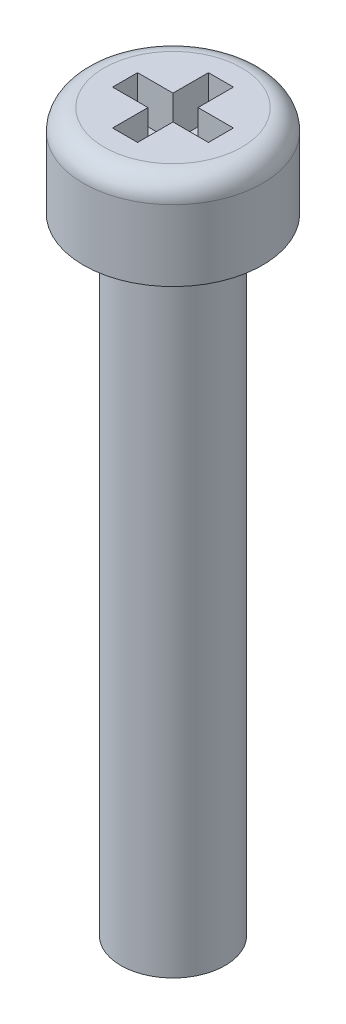
ISO-10303-21;
HEADER;
FILE_DESCRIPTION(('STEP AP214'),'2;1');
FILE_NAME('part.step','',(''),(''),'','','');
FILE_SCHEMA(('AUTOMOTIVE_DESIGN { 1 0 10303 214 1 1 1 1 }'));
ENDSEC;
DATA;
#1=APPLICATION_CONTEXT('core data for automotive mechanical design processes');
#2=APPLICATION_PROTOCOL_DEFINITION('international standard','automotive_design',2000,#1);
#3=PRODUCT_CONTEXT('',#1,'mechanical');
#4=PRODUCT('Part','Part','',(#3));
#5=PRODUCT_RELATED_PRODUCT_CATEGORY('part','',(#4));
#6=PRODUCT_DEFINITION_FORMATION('','',#4);
#7=PRODUCT_DEFINITION_CONTEXT('part definition',#1,'design');
#8=PRODUCT_DEFINITION('design','',#6,#7);
#9=PRODUCT_DEFINITION_SHAPE('','',#8);
#10=(LENGTH_UNIT() NAMED_UNIT(*) SI_UNIT(.MILLI.,.METRE.));
#11=(NAMED_UNIT(*) PLANE_ANGLE_UNIT() SI_UNIT($,.RADIAN.));
#12=(NAMED_UNIT(*) SI_UNIT($,.STERADIAN.) SOLID_ANGLE_UNIT());
#13=UNCERTAINTY_MEASURE_WITH_UNIT(LENGTH_MEASURE(1.E-05),#10,'distance_accuracy_value','');
#14=(GEOMETRIC_REPRESENTATION_CONTEXT(3) GLOBAL_UNCERTAINTY_ASSIGNED_CONTEXT((#13)) GLOBAL_UNIT_ASSIGNED_CONTEXT((#10,
#11,#12)) REPRESENTATION_CONTEXT('',''));
#15=CARTESIAN_POINT('',(0.,0.,0.));
#16=DIRECTION('',(0.,0.,1.));
#17=DIRECTION('',(1.,0.,0.));
#18=AXIS2_PLACEMENT_3D('',#15,#16,#17);
#19=CARTESIAN_POINT('',(0.,-15.,0.));
#20=DIRECTION('',(0.,1.,0.));
#21=DIRECTION('',(0.,0.,1.));
#22=AXIS2_PLACEMENT_3D('',#19,#20,#21);
#23=CYLINDRICAL_SURFACE('',#22,1.25);
#24=CARTESIAN_POINT('',(0.,-15.,0.));
#25=DIRECTION('',(0.,1.,0.));
#26=DIRECTION('',(0.,0.,1.));
#27=AXIS2_PLACEMENT_3D('',#24,#25,#26);
#28=CIRCLE('',#27,1.25);
#29=CARTESIAN_POINT('',(0.,-15.,1.25));
#30=VERTEX_POINT('',#29);
#31=EDGE_CURVE('E11',#30,#30,#28,.T.);
#32=ORIENTED_EDGE('',*,*,#31,.T.);
#33=EDGE_LOOP('',(#32));
#34=FACE_BOUND('',#33,.T.);
#35=CARTESIAN_POINT('',(0.,0.,0.));
#36=DIRECTION('',(0.,1.,0.));
#37=DIRECTION('',(0.,0.,1.));
#38=AXIS2_PLACEMENT_3D('',#35,#36,#37);
#39=CIRCLE('',#38,1.25);
#40=CARTESIAN_POINT('',(0.,0.,1.25));
#41=VERTEX_POINT('',#40);
#42=EDGE_CURVE('E48',#41,#41,#39,.T.);
#43=ORIENTED_EDGE('',*,*,#42,.F.);
#44=EDGE_LOOP('',(#43));
#45=FACE_BOUND('',#44,.T.);
#46=ADVANCED_FACE('F45',(#34,#45),#23,.T.);
#47=CARTESIAN_POINT('',(0.,-15.,0.));
#48=DIRECTION('',(0.,1.,0.));
#49=DIRECTION('',(0.,0.,1.));
#50=AXIS2_PLACEMENT_3D('',#47,#48,#49);
#51=PLANE('',#50);
#52=ORIENTED_EDGE('',*,*,#31,.F.);
#53=EDGE_LOOP('',(#52));
#54=FACE_BOUND('',#53,.T.);
#55=ADVANCED_FACE('F233',(#54),#51,.F.);
#56=CARTESIAN_POINT('',(0.,0.,0.));
#57=DIRECTION('',(0.,-1.,0.));
#58=DIRECTION('',(0.,0.,-1.));
#59=AXIS2_PLACEMENT_3D('',#56,#57,#58);
#60=PLANE('',#59);
#61=ORIENTED_EDGE('',*,*,#42,.T.);
#62=EDGE_LOOP('',(#61));
#63=FACE_BOUND('',#62,.T.);
#64=CARTESIAN_POINT('',(0.,0.,0.));
#65=DIRECTION('',(0.,-1.,0.));
#66=DIRECTION('',(0.,0.,-1.));
#67=AXIS2_PLACEMENT_3D('',#64,#65,#66);
#68=CIRCLE('',#67,2.15);
#69=CARTESIAN_POINT('',(0.,0.,-2.15));
#70=VERTEX_POINT('',#69);
#71=EDGE_CURVE('E223',#70,#70,#68,.T.);
#72=ORIENTED_EDGE('',*,*,#71,.T.);
#73=EDGE_LOOP('',(#72));
#74=FACE_BOUND('',#73,.T.);
#75=ADVANCED_FACE('F230',(#63,#74),#60,.T.);
#76=CARTESIAN_POINT('',(0.,0.,0.));
#77=DIRECTION('',(0.,-1.,0.));
#78=DIRECTION('',(0.,0.,-1.));
#79=AXIS2_PLACEMENT_3D('',#76,#77,#78);
#80=CYLINDRICAL_SURFACE('',#79,2.15);
#81=CARTESIAN_POINT('',(0.,1.7,0.));
#82=DIRECTION('',(0.,-1.,0.));
#83=DIRECTION('',(0.,0.,-1.));
#84=AXIS2_PLACEMENT_3D('',#81,#82,#83);
#85=CIRCLE('',#84,2.15);
#86=CARTESIAN_POINT('',(0.,1.7,-2.15));
#87=VERTEX_POINT('',#86);
#88=EDGE_CURVE('E220',#87,#87,#85,.T.);
#89=ORIENTED_EDGE('',*,*,#88,.T.);
#90=EDGE_LOOP('',(#89));
#91=FACE_BOUND('',#90,.T.);
#92=ORIENTED_EDGE('',*,*,#71,.F.);
#93=EDGE_LOOP('',(#92));
#94=FACE_BOUND('',#93,.T.);
#95=ADVANCED_FACE('F243',(#91,#94),#80,.T.);
#96=CARTESIAN_POINT('',(0.,1.7,0.));
#97=DIRECTION('',(0.,-1.,0.));
#98=DIRECTION('',(0.,0.,-1.));
#99=AXIS2_PLACEMENT_3D('',#96,#97,#98);
#100=TOROIDAL_SURFACE('',#99,1.65,0.5);
#101=CARTESIAN_POINT('',(0.,2.2,0.));
#102=DIRECTION('',(0.,-1.,0.));
#103=DIRECTION('',(0.,0.,-1.));
#104=AXIS2_PLACEMENT_3D('',#101,#102,#103);
#105=CIRCLE('',#104,1.65);
#106=CARTESIAN_POINT('',(0.,2.2,-1.65));
#107=VERTEX_POINT('',#106);
#108=EDGE_CURVE('E200',#107,#107,#105,.T.);
#109=ORIENTED_EDGE('',*,*,#108,.T.);
#110=EDGE_LOOP('',(#109));
#111=FACE_BOUND('',#110,.T.);
#112=ORIENTED_EDGE('',*,*,#88,.F.);
#113=EDGE_LOOP('',(#112));
#114=FACE_BOUND('',#113,.T.);
#115=ADVANCED_FACE('F248',(#111,#114),#100,.T.);
#116=CARTESIAN_POINT('',(0.,2.2,0.));
#117=DIRECTION('',(0.,1.,0.));
#118=DIRECTION('',(0.,0.,1.));
#119=AXIS2_PLACEMENT_3D('',#116,#117,#118);
#120=PLANE('',#119);
#121=DIRECTION('',(0.,0.,-1.));
#122=VECTOR('',#121,1.);
#123=CARTESIAN_POINT('',(0.3,2.2,-0.299999999999999));
#124=LINE('',#123,#122);
#125=CARTESIAN_POINT('',(0.3,2.2,-0.299999999999999));
#126=VERTEX_POINT('',#125);
#127=CARTESIAN_POINT('',(0.3,2.2,-1.15));
#128=VERTEX_POINT('',#127);
#129=EDGE_CURVE('E59',#126,#128,#124,.T.);
#130=ORIENTED_EDGE('',*,*,#129,.F.);
#131=DIRECTION('',(-1.,0.,0.));
#132=VECTOR('',#131,1.);
#133=CARTESIAN_POINT('',(0.3,2.2,-0.299999999999999));
#134=LINE('',#133,#132);
#135=CARTESIAN_POINT('',(1.15,2.2,-0.299999999999999));
#136=VERTEX_POINT('',#135);
#137=EDGE_CURVE('E196',#136,#126,#134,.T.);
#138=ORIENTED_EDGE('',*,*,#137,.F.);
#139=DIRECTION('',(0.,0.,-1.));
#140=VECTOR('',#139,1.);
#141=CARTESIAN_POINT('',(1.15,2.2,0.3));
#142=LINE('',#141,#140);
#143=CARTESIAN_POINT('',(1.15,2.2,0.3));
#144=VERTEX_POINT('',#143);
#145=EDGE_CURVE('E194',#144,#136,#142,.T.);
#146=ORIENTED_EDGE('',*,*,#145,.F.);
#147=DIRECTION('',(1.,0.,0.));
#148=VECTOR('',#147,1.);
#149=CARTESIAN_POINT('',(0.3,2.2,0.3));
#150=LINE('',#149,#148);
#151=CARTESIAN_POINT('',(0.3,2.2,0.3));
#152=VERTEX_POINT('',#151);
#153=EDGE_CURVE('E143',#152,#144,#150,.T.);
#154=ORIENTED_EDGE('',*,*,#153,.F.);
#155=DIRECTION('',(0.,0.,-1.));
#156=VECTOR('',#155,1.);
#157=CARTESIAN_POINT('',(0.3,2.2,1.15));
#158=LINE('',#157,#156);
#159=CARTESIAN_POINT('',(0.3,2.2,1.15));
#160=VERTEX_POINT('',#159);
#161=EDGE_CURVE('E190',#160,#152,#158,.T.);
#162=ORIENTED_EDGE('',*,*,#161,.F.);
#163=DIRECTION('',(1.,0.,0.));
#164=VECTOR('',#163,1.);
#165=CARTESIAN_POINT('',(-0.3,2.2,1.15));
#166=LINE('',#165,#164);
#167=CARTESIAN_POINT('',(-0.3,2.2,1.15));
#168=VERTEX_POINT('',#167);
#169=EDGE_CURVE('E187',#168,#160,#166,.T.);
#170=ORIENTED_EDGE('',*,*,#169,.F.);
#171=DIRECTION('',(0.,0.,1.));
#172=VECTOR('',#171,1.);
#173=CARTESIAN_POINT('',(-0.3,2.2,1.15));
#174=LINE('',#173,#172);
#175=CARTESIAN_POINT('',(-0.3,2.2,0.3));
#176=VERTEX_POINT('',#175);
#177=EDGE_CURVE('E184',#176,#168,#174,.T.);
#178=ORIENTED_EDGE('',*,*,#177,.F.);
#179=DIRECTION('',(1.,0.,0.));
#180=VECTOR('',#179,1.);
#181=CARTESIAN_POINT('',(-1.15,2.2,0.3));
#182=LINE('',#181,#180);
#183=CARTESIAN_POINT('',(-1.15,2.2,0.3));
#184=VERTEX_POINT('',#183);
#185=EDGE_CURVE('E181',#184,#176,#182,.T.);
#186=ORIENTED_EDGE('',*,*,#185,.F.);
#187=DIRECTION('',(0.,0.,1.));
#188=VECTOR('',#187,1.);
#189=CARTESIAN_POINT('',(-1.15,2.2,0.3));
#190=LINE('',#189,#188);
#191=CARTESIAN_POINT('',(-1.15,2.2,-0.3));
#192=VERTEX_POINT('',#191);
#193=EDGE_CURVE('E178',#192,#184,#190,.T.);
#194=ORIENTED_EDGE('',*,*,#193,.F.);
#195=DIRECTION('',(-1.,0.,0.));
#196=VECTOR('',#195,1.);
#197=CARTESIAN_POINT('',(-1.15,2.2,-0.3));
#198=LINE('',#197,#196);
#199=CARTESIAN_POINT('',(-0.3,2.2,-0.3));
#200=VERTEX_POINT('',#199);
#201=EDGE_CURVE('E175',#200,#192,#198,.T.);
#202=ORIENTED_EDGE('',*,*,#201,.F.);
#203=DIRECTION('',(0.,0.,1.));
#204=VECTOR('',#203,1.);
#205=CARTESIAN_POINT('',(-0.3,2.2,-0.3));
#206=LINE('',#205,#204);
#207=CARTESIAN_POINT('',(-0.3,2.2,-1.15));
#208=VERTEX_POINT('',#207);
#209=EDGE_CURVE('E172',#208,#200,#206,.T.);
#210=ORIENTED_EDGE('',*,*,#209,.F.);
#211=DIRECTION('',(-1.,0.,0.));
#212=VECTOR('',#211,1.);
#213=CARTESIAN_POINT('',(-0.3,2.2,-1.15));
#214=LINE('',#213,#212);
#215=EDGE_CURVE('E169',#128,#208,#214,.T.);
#216=ORIENTED_EDGE('',*,*,#215,.F.);
#217=EDGE_LOOP('',(#130,#138,#146,#154,#162,#170,#178,#186,#194,#202,#210,#216));
#218=FACE_BOUND('',#217,.T.);
#219=ORIENTED_EDGE('',*,*,#108,.F.);
#220=EDGE_LOOP('',(#219));
#221=FACE_BOUND('',#220,.T.);
#222=ADVANCED_FACE('F252',(#218,#221),#120,.T.);
#223=CARTESIAN_POINT('',(0.3,1.2,-0.299999999999999));
#224=DIRECTION('',(1.,0.,0.));
#225=DIRECTION('',(0.,0.,-1.));
#226=AXIS2_PLACEMENT_3D('',#223,#224,#225);
#227=PLANE('',#226);
#228=ORIENTED_EDGE('',*,*,#129,.T.);
#229=DIRECTION('',(0.,1.,0.));
#230=VECTOR('',#229,1.);
#231=CARTESIAN_POINT('',(0.3,1.2,-1.15));
#232=LINE('',#231,#230);
#233=CARTESIAN_POINT('',(0.3,1.2,-1.15));
#234=VERTEX_POINT('',#233);
#235=EDGE_CURVE('E107',#234,#128,#232,.T.);
#236=ORIENTED_EDGE('',*,*,#235,.F.);
#237=DIRECTION('',(0.,0.,-1.));
#238=VECTOR('',#237,1.);
#239=CARTESIAN_POINT('',(0.3,1.2,-0.299999999999999));
#240=LINE('',#239,#238);
#241=CARTESIAN_POINT('',(0.3,1.2,-0.299999999999999));
#242=VERTEX_POINT('',#241);
#243=EDGE_CURVE('E198',#242,#234,#240,.T.);
#244=ORIENTED_EDGE('',*,*,#243,.F.);
#245=DIRECTION('',(0.,1.,0.));
#246=VECTOR('',#245,1.);
#247=CARTESIAN_POINT('',(0.3,1.2,-0.299999999999999));
#248=LINE('',#247,#246);
#249=EDGE_CURVE('E67',#242,#126,#248,.T.);
#250=ORIENTED_EDGE('',*,*,#249,.T.);
#251=EDGE_LOOP('',(#228,#236,#244,#250));
#252=FACE_BOUND('',#251,.T.);
#253=ADVANCED_FACE('F256',(#252),#227,.F.);
#254=CARTESIAN_POINT('',(0.3,1.2,-0.299999999999999));
#255=DIRECTION('',(0.,0.,-1.));
#256=DIRECTION('',(-1.,0.,0.));
#257=AXIS2_PLACEMENT_3D('',#254,#255,#256);
#258=PLANE('',#257);
#259=ORIENTED_EDGE('',*,*,#137,.T.);
#260=ORIENTED_EDGE('',*,*,#249,.F.);
#261=DIRECTION('',(-1.,0.,0.));
#262=VECTOR('',#261,1.);
#263=CARTESIAN_POINT('',(0.3,1.2,-0.299999999999999));
#264=LINE('',#263,#262);
#265=CARTESIAN_POINT('',(1.15,1.2,-0.299999999999999));
#266=VERTEX_POINT('',#265);
#267=EDGE_CURVE('E155',#266,#242,#264,.T.);
#268=ORIENTED_EDGE('',*,*,#267,.F.);
#269=DIRECTION('',(0.,1.,0.));
#270=VECTOR('',#269,1.);
#271=CARTESIAN_POINT('',(1.15,1.2,-0.299999999999999));
#272=LINE('',#271,#270);
#273=EDGE_CURVE('E147',#266,#136,#272,.T.);
#274=ORIENTED_EDGE('',*,*,#273,.T.);
#275=EDGE_LOOP('',(#259,#260,#268,#274));
#276=FACE_BOUND('',#275,.T.);
#277=ADVANCED_FACE('F260',(#276),#258,.F.);
#278=CARTESIAN_POINT('',(1.15,1.2,0.3));
#279=DIRECTION('',(1.,0.,0.));
#280=DIRECTION('',(0.,0.,-1.));
#281=AXIS2_PLACEMENT_3D('',#278,#279,#280);
#282=PLANE('',#281);
#283=ORIENTED_EDGE('',*,*,#145,.T.);
#284=ORIENTED_EDGE('',*,*,#273,.F.);
#285=DIRECTION('',(0.,0.,-1.));
#286=VECTOR('',#285,1.);
#287=CARTESIAN_POINT('',(1.15,1.2,0.3));
#288=LINE('',#287,#286);
#289=CARTESIAN_POINT('',(1.15,1.2,0.3));
#290=VERTEX_POINT('',#289);
#291=EDGE_CURVE('E151',#290,#266,#288,.T.);
#292=ORIENTED_EDGE('',*,*,#291,.F.);
#293=DIRECTION('',(0.,1.,0.));
#294=VECTOR('',#293,1.);
#295=CARTESIAN_POINT('',(1.15,1.2,0.3));
#296=LINE('',#295,#294);
#297=EDGE_CURVE('E136',#290,#144,#296,.T.);
#298=ORIENTED_EDGE('',*,*,#297,.T.);
#299=EDGE_LOOP('',(#283,#284,#292,#298));
#300=FACE_BOUND('',#299,.T.);
#301=ADVANCED_FACE('F152',(#300),#282,.F.);
#302=CARTESIAN_POINT('',(0.3,1.2,0.3));
#303=DIRECTION('',(0.,0.,1.));
#304=DIRECTION('',(1.,0.,0.));
#305=AXIS2_PLACEMENT_3D('',#302,#303,#304);
#306=PLANE('',#305);
#307=ORIENTED_EDGE('',*,*,#153,.T.);
#308=ORIENTED_EDGE('',*,*,#297,.F.);
#309=DIRECTION('',(1.,0.,0.));
#310=VECTOR('',#309,1.);
#311=CARTESIAN_POINT('',(0.3,1.2,0.3));
#312=LINE('',#311,#310);
#313=CARTESIAN_POINT('',(0.3,1.2,0.3));
#314=VERTEX_POINT('',#313);
#315=EDGE_CURVE('E140',#314,#290,#312,.T.);
#316=ORIENTED_EDGE('',*,*,#315,.F.);
#317=DIRECTION('',(0.,1.,0.));
#318=VECTOR('',#317,1.);
#319=CARTESIAN_POINT('',(0.3,1.2,0.3));
#320=LINE('',#319,#318);
#321=EDGE_CURVE('E148',#314,#152,#320,.T.);
#322=ORIENTED_EDGE('',*,*,#321,.T.);
#323=EDGE_LOOP('',(#307,#308,#316,#322));
#324=FACE_BOUND('',#323,.T.);
#325=ADVANCED_FACE('F138',(#324),#306,.F.);
#326=CARTESIAN_POINT('',(0.3,1.2,1.15));
#327=DIRECTION('',(1.,0.,0.));
#328=DIRECTION('',(0.,0.,-1.));
#329=AXIS2_PLACEMENT_3D('',#326,#327,#328);
#330=PLANE('',#329);
#331=ORIENTED_EDGE('',*,*,#161,.T.);
#332=ORIENTED_EDGE('',*,*,#321,.F.);
#333=DIRECTION('',(0.,0.,-1.));
#334=VECTOR('',#333,1.);
#335=CARTESIAN_POINT('',(0.3,1.2,1.15));
#336=LINE('',#335,#334);
#337=CARTESIAN_POINT('',(0.3,1.2,1.15));
#338=VERTEX_POINT('',#337);
#339=EDGE_CURVE('E161',#338,#314,#336,.T.);
#340=ORIENTED_EDGE('',*,*,#339,.F.);
#341=DIRECTION('',(0.,1.,0.));
#342=VECTOR('',#341,1.);
#343=CARTESIAN_POINT('',(0.3,1.2,1.15));
#344=LINE('',#343,#342);
#345=EDGE_CURVE('E203',#338,#160,#344,.T.);
#346=ORIENTED_EDGE('',*,*,#345,.T.);
#347=EDGE_LOOP('',(#331,#332,#340,#346));
#348=FACE_BOUND('',#347,.T.);
#349=ADVANCED_FACE('F288',(#348),#330,.F.);
#350=CARTESIAN_POINT('',(-0.3,1.2,1.15));
#351=DIRECTION('',(0.,0.,1.));
#352=DIRECTION('',(1.,0.,0.));
#353=AXIS2_PLACEMENT_3D('',#350,#351,#352);
#354=PLANE('',#353);
#355=ORIENTED_EDGE('',*,*,#169,.T.);
#356=ORIENTED_EDGE('',*,*,#345,.F.);
#357=DIRECTION('',(1.,0.,0.));
#358=VECTOR('',#357,1.);
#359=CARTESIAN_POINT('',(-0.3,1.2,1.15));
#360=LINE('',#359,#358);
#361=CARTESIAN_POINT('',(-0.3,1.2,1.15));
#362=VERTEX_POINT('',#361);
#363=EDGE_CURVE('E163',#362,#338,#360,.T.);
#364=ORIENTED_EDGE('',*,*,#363,.F.);
#365=DIRECTION('',(0.,1.,0.));
#366=VECTOR('',#365,1.);
#367=CARTESIAN_POINT('',(-0.3,1.2,1.15));
#368=LINE('',#367,#366);
#369=EDGE_CURVE('E205',#362,#168,#368,.T.);
#370=ORIENTED_EDGE('',*,*,#369,.T.);
#371=EDGE_LOOP('',(#355,#356,#364,#370));
#372=FACE_BOUND('',#371,.T.);
#373=ADVANCED_FACE('F284',(#372),#354,.F.);
#374=CARTESIAN_POINT('',(-0.3,1.2,1.15));
#375=DIRECTION('',(-1.,0.,0.));
#376=DIRECTION('',(0.,0.,1.));
#377=AXIS2_PLACEMENT_3D('',#374,#375,#376);
#378=PLANE('',#377);
#379=ORIENTED_EDGE('',*,*,#177,.T.);
#380=ORIENTED_EDGE('',*,*,#369,.F.);
#381=DIRECTION('',(0.,0.,1.));
#382=VECTOR('',#381,1.);
#383=CARTESIAN_POINT('',(-0.3,1.2,1.15));
#384=LINE('',#383,#382);
#385=CARTESIAN_POINT('',(-0.3,1.2,0.3));
#386=VERTEX_POINT('',#385);
#387=EDGE_CURVE('E435',#386,#362,#384,.T.);
#388=ORIENTED_EDGE('',*,*,#387,.F.);
#389=DIRECTION('',(0.,1.,0.));
#390=VECTOR('',#389,1.);
#391=CARTESIAN_POINT('',(-0.3,1.2,0.3));
#392=LINE('',#391,#390);
#393=EDGE_CURVE('E207',#386,#176,#392,.T.);
#394=ORIENTED_EDGE('',*,*,#393,.T.);
#395=EDGE_LOOP('',(#379,#380,#388,#394));
#396=FACE_BOUND('',#395,.T.);
#397=ADVANCED_FACE('F280',(#396),#378,.F.);
#398=CARTESIAN_POINT('',(-1.15,1.2,0.3));
#399=DIRECTION('',(0.,0.,1.));
#400=DIRECTION('',(1.,0.,0.));
#401=AXIS2_PLACEMENT_3D('',#398,#399,#400);
#402=PLANE('',#401);
#403=ORIENTED_EDGE('',*,*,#185,.T.);
#404=ORIENTED_EDGE('',*,*,#393,.F.);
#405=DIRECTION('',(1.,0.,0.));
#406=VECTOR('',#405,1.);
#407=CARTESIAN_POINT('',(-1.15,1.2,0.3));
#408=LINE('',#407,#406);
#409=CARTESIAN_POINT('',(-1.15,1.2,0.3));
#410=VERTEX_POINT('',#409);
#411=EDGE_CURVE('E432',#410,#386,#408,.T.);
#412=ORIENTED_EDGE('',*,*,#411,.F.);
#413=DIRECTION('',(0.,1.,0.));
#414=VECTOR('',#413,1.);
#415=CARTESIAN_POINT('',(-1.15,1.2,0.3));
#416=LINE('',#415,#414);
#417=EDGE_CURVE('E209',#410,#184,#416,.T.);
#418=ORIENTED_EDGE('',*,*,#417,.T.);
#419=EDGE_LOOP('',(#403,#404,#412,#418));
#420=FACE_BOUND('',#419,.T.);
#421=ADVANCED_FACE('F276',(#420),#402,.F.);
#422=CARTESIAN_POINT('',(-1.15,1.2,0.3));
#423=DIRECTION('',(-1.,0.,0.));
#424=DIRECTION('',(0.,0.,1.));
#425=AXIS2_PLACEMENT_3D('',#422,#423,#424);
#426=PLANE('',#425);
#427=ORIENTED_EDGE('',*,*,#193,.T.);
#428=ORIENTED_EDGE('',*,*,#417,.F.);
#429=DIRECTION('',(0.,0.,1.));
#430=VECTOR('',#429,1.);
#431=CARTESIAN_POINT('',(-1.15,1.2,0.3));
#432=LINE('',#431,#430);
#433=CARTESIAN_POINT('',(-1.15,1.2,-0.3));
#434=VERTEX_POINT('',#433);
#435=EDGE_CURVE('E429',#434,#410,#432,.T.);
#436=ORIENTED_EDGE('',*,*,#435,.F.);
#437=DIRECTION('',(0.,1.,0.));
#438=VECTOR('',#437,1.);
#439=CARTESIAN_POINT('',(-1.15,1.2,-0.3));
#440=LINE('',#439,#438);
#441=EDGE_CURVE('E211',#434,#192,#440,.T.);
#442=ORIENTED_EDGE('',*,*,#441,.T.);
#443=EDGE_LOOP('',(#427,#428,#436,#442));
#444=FACE_BOUND('',#443,.T.);
#445=ADVANCED_FACE('F272',(#444),#426,.F.);
#446=CARTESIAN_POINT('',(-1.15,1.2,-0.3));
#447=DIRECTION('',(0.,0.,-1.));
#448=DIRECTION('',(-1.,0.,0.));
#449=AXIS2_PLACEMENT_3D('',#446,#447,#448);
#450=PLANE('',#449);
#451=ORIENTED_EDGE('',*,*,#201,.T.);
#452=ORIENTED_EDGE('',*,*,#441,.F.);
#453=DIRECTION('',(-1.,0.,0.));
#454=VECTOR('',#453,1.);
#455=CARTESIAN_POINT('',(-1.15,1.2,-0.3));
#456=LINE('',#455,#454);
#457=CARTESIAN_POINT('',(-0.3,1.2,-0.3));
#458=VERTEX_POINT('',#457);
#459=EDGE_CURVE('E426',#458,#434,#456,.T.);
#460=ORIENTED_EDGE('',*,*,#459,.F.);
#461=DIRECTION('',(0.,1.,0.));
#462=VECTOR('',#461,1.);
#463=CARTESIAN_POINT('',(-0.3,1.2,-0.3));
#464=LINE('',#463,#462);
#465=EDGE_CURVE('E213',#458,#200,#464,.T.);
#466=ORIENTED_EDGE('',*,*,#465,.T.);
#467=EDGE_LOOP('',(#451,#452,#460,#466));
#468=FACE_BOUND('',#467,.T.);
#469=ADVANCED_FACE('F268',(#468),#450,.F.);
#470=CARTESIAN_POINT('',(-0.3,1.2,-0.3));
#471=DIRECTION('',(-1.,0.,0.));
#472=DIRECTION('',(0.,0.,1.));
#473=AXIS2_PLACEMENT_3D('',#470,#471,#472);
#474=PLANE('',#473);
#475=ORIENTED_EDGE('',*,*,#209,.T.);
#476=ORIENTED_EDGE('',*,*,#465,.F.);
#477=DIRECTION('',(0.,0.,1.));
#478=VECTOR('',#477,1.);
#479=CARTESIAN_POINT('',(-0.3,1.2,-0.3));
#480=LINE('',#479,#478);
#481=CARTESIAN_POINT('',(-0.3,1.2,-1.15));
#482=VERTEX_POINT('',#481);
#483=EDGE_CURVE('E421',#482,#458,#480,.T.);
#484=ORIENTED_EDGE('',*,*,#483,.F.);
#485=DIRECTION('',(0.,1.,0.));
#486=VECTOR('',#485,1.);
#487=CARTESIAN_POINT('',(-0.3,1.2,-1.15));
#488=LINE('',#487,#486);
#489=EDGE_CURVE('E215',#482,#208,#488,.T.);
#490=ORIENTED_EDGE('',*,*,#489,.T.);
#491=EDGE_LOOP('',(#475,#476,#484,#490));
#492=FACE_BOUND('',#491,.T.);
#493=ADVANCED_FACE('F264',(#492),#474,.F.);
#494=CARTESIAN_POINT('',(-0.3,1.2,-1.15));
#495=DIRECTION('',(0.,0.,-1.));
#496=DIRECTION('',(-1.,0.,0.));
#497=AXIS2_PLACEMENT_3D('',#494,#495,#496);
#498=PLANE('',#497);
#499=ORIENTED_EDGE('',*,*,#215,.T.);
#500=ORIENTED_EDGE('',*,*,#489,.F.);
#501=DIRECTION('',(-1.,0.,0.));
#502=VECTOR('',#501,1.);
#503=CARTESIAN_POINT('',(-0.3,1.2,-1.15));
#504=LINE('',#503,#502);
#505=EDGE_CURVE('E419',#234,#482,#504,.T.);
#506=ORIENTED_EDGE('',*,*,#505,.F.);
#507=ORIENTED_EDGE('',*,*,#235,.T.);
#508=EDGE_LOOP('',(#499,#500,#506,#507));
#509=FACE_BOUND('',#508,.T.);
#510=ADVANCED_FACE('F261',(#509),#498,.F.);
#511=CARTESIAN_POINT('',(0.,1.2,0.));
#512=DIRECTION('',(0.,-1.,0.));
#513=DIRECTION('',(0.,0.,-1.));
#514=AXIS2_PLACEMENT_3D('',#511,#512,#513);
#515=PLANE('',#514);
#516=ORIENTED_EDGE('',*,*,#243,.T.);
#517=ORIENTED_EDGE('',*,*,#505,.T.);
#518=ORIENTED_EDGE('',*,*,#483,.T.);
#519=ORIENTED_EDGE('',*,*,#459,.T.);
#520=ORIENTED_EDGE('',*,*,#435,.T.);
#521=ORIENTED_EDGE('',*,*,#411,.T.);
#522=ORIENTED_EDGE('',*,*,#387,.T.);
#523=ORIENTED_EDGE('',*,*,#363,.T.);
#524=ORIENTED_EDGE('',*,*,#339,.T.);
#525=ORIENTED_EDGE('',*,*,#315,.T.);
#526=ORIENTED_EDGE('',*,*,#291,.T.);
#527=ORIENTED_EDGE('',*,*,#267,.T.);
#528=EDGE_LOOP('',(#516,#517,#518,#519,#520,#521,#522,#523,#524,#525,#526,#527));
#529=FACE_BOUND('',#528,.T.);
#530=ADVANCED_FACE('F158',(#529),#515,.F.);
#531=CLOSED_SHELL('',(#46,#55,#75,#95,#115,#222,#253,#277,#301,#325,#349,#373,#397,#421,#445,
#469,#493,#510,#530));
#532=MANIFOLD_SOLID_BREP('B2',#531);
#533=ADVANCED_BREP_SHAPE_REPRESENTATION('',(#18,#532),#14);
#534=SHAPE_DEFINITION_REPRESENTATION(#9,#533);
ENDSEC;
END-ISO-10303-21;
